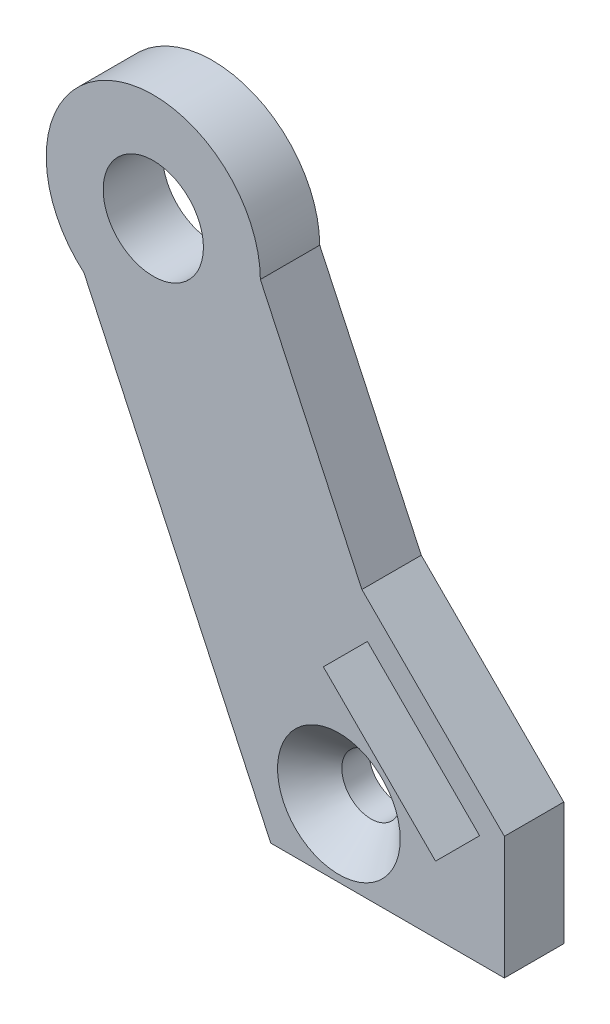
ISO-10303-21;
HEADER;
FILE_DESCRIPTION(('STEP AP214'),'2;1');
FILE_NAME('part.step','',(''),(''),'','','');
FILE_SCHEMA(('AUTOMOTIVE_DESIGN { 1 0 10303 214 1 1 1 1 }'));
ENDSEC;
DATA;
#1=APPLICATION_CONTEXT('core data for automotive mechanical design processes');
#2=APPLICATION_PROTOCOL_DEFINITION('international standard','automotive_design',2000,#1);
#3=PRODUCT_CONTEXT('',#1,'mechanical');
#4=PRODUCT('Part','Part','',(#3));
#5=PRODUCT_RELATED_PRODUCT_CATEGORY('part','',(#4));
#6=PRODUCT_DEFINITION_FORMATION('','',#4);
#7=PRODUCT_DEFINITION_CONTEXT('part definition',#1,'design');
#8=PRODUCT_DEFINITION('design','',#6,#7);
#9=PRODUCT_DEFINITION_SHAPE('','',#8);
#10=(LENGTH_UNIT() NAMED_UNIT(*) SI_UNIT(.MILLI.,.METRE.));
#11=(NAMED_UNIT(*) PLANE_ANGLE_UNIT() SI_UNIT($,.RADIAN.));
#12=(NAMED_UNIT(*) SI_UNIT($,.STERADIAN.) SOLID_ANGLE_UNIT());
#13=UNCERTAINTY_MEASURE_WITH_UNIT(LENGTH_MEASURE(1.E-05),#10,'distance_accuracy_value','');
#14=(GEOMETRIC_REPRESENTATION_CONTEXT(3) GLOBAL_UNCERTAINTY_ASSIGNED_CONTEXT((#13)) GLOBAL_UNIT_ASSIGNED_CONTEXT((#10,
#11,#12)) REPRESENTATION_CONTEXT('',''));
#15=CARTESIAN_POINT('',(0.,0.,0.));
#16=DIRECTION('',(0.,0.,1.));
#17=DIRECTION('',(1.,0.,0.));
#18=AXIS2_PLACEMENT_3D('',#15,#16,#17);
#19=CARTESIAN_POINT('',(3.5,3.5,3.05));
#20=DIRECTION('',(0.,0.,-1.));
#21=DIRECTION('',(-1.,0.,0.));
#22=AXIS2_PLACEMENT_3D('',#19,#20,#21);
#23=CYLINDRICAL_SURFACE('',#22,1.5);
#24=CARTESIAN_POINT('',(3.5,3.5,0.));
#25=DIRECTION('',(0.,0.,1.));
#26=DIRECTION('',(1.,0.,0.));
#27=AXIS2_PLACEMENT_3D('',#24,#25,#26);
#28=CIRCLE('',#27,1.5);
#29=CARTESIAN_POINT('',(5.,3.5,0.));
#30=VERTEX_POINT('',#29);
#31=EDGE_CURVE('E161',#30,#30,#28,.T.);
#32=ORIENTED_EDGE('',*,*,#31,.F.);
#33=EDGE_LOOP('',(#32));
#34=FACE_BOUND('',#33,.T.);
#35=CARTESIAN_POINT('',(3.5,3.5,1.4));
#36=DIRECTION('',(0.,0.,1.));
#37=DIRECTION('',(1.,0.,0.));
#38=AXIS2_PLACEMENT_3D('',#35,#36,#37);
#39=CIRCLE('',#38,1.5);
#40=CARTESIAN_POINT('',(5.,3.5,1.4));
#41=VERTEX_POINT('',#40);
#42=EDGE_CURVE('E11',#41,#41,#39,.T.);
#43=ORIENTED_EDGE('',*,*,#42,.T.);
#44=EDGE_LOOP('',(#43));
#45=FACE_BOUND('',#44,.T.);
#46=ADVANCED_FACE('F45',(#34,#45),#23,.F.);
#47=CARTESIAN_POINT('',(8.20970869120796,8.20970869120796,3.05));
#48=DIRECTION('',(0.707106781186548,0.707106781186547,0.));
#49=DIRECTION('',(-0.707106781186547,0.707106781186548,0.));
#50=AXIS2_PLACEMENT_3D('',#47,#48,#49);
#51=PLANE('',#50);
#52=DIRECTION('',(0.707106781186547,-0.707106781186548,0.));
#53=VECTOR('',#52,1.);
#54=CARTESIAN_POINT('',(8.20970869120796,8.20970869120796,0.));
#55=LINE('',#54,#53);
#56=CARTESIAN_POINT('',(4.96428752719385,11.4551298552221,0.));
#57=VERTEX_POINT('',#56);
#58=CARTESIAN_POINT('',(10.7272077938642,5.6922095885517,0.));
#59=VERTEX_POINT('',#58);
#60=EDGE_CURVE('E194',#57,#59,#55,.T.);
#61=ORIENTED_EDGE('',*,*,#60,.T.);
#62=DIRECTION('',(0.,0.,-1.));
#63=VECTOR('',#62,1.);
#64=CARTESIAN_POINT('',(10.7272077938642,5.6922095885517,3.05));
#65=LINE('',#64,#63);
#66=CARTESIAN_POINT('',(10.7272077938642,5.6922095885517,3.05));
#67=VERTEX_POINT('',#66);
#68=EDGE_CURVE('E55',#67,#59,#65,.T.);
#69=ORIENTED_EDGE('',*,*,#68,.F.);
#70=DIRECTION('',(0.707106781186547,-0.707106781186548,0.));
#71=VECTOR('',#70,1.);
#72=CARTESIAN_POINT('',(8.20970869120796,8.20970869120796,3.05));
#73=LINE('',#72,#71);
#74=CARTESIAN_POINT('',(4.96428752719385,11.4551298552221,3.05));
#75=VERTEX_POINT('',#74);
#76=EDGE_CURVE('E149',#75,#67,#73,.T.);
#77=ORIENTED_EDGE('',*,*,#76,.F.);
#78=DIRECTION('',(0.,0.,-1.));
#79=VECTOR('',#78,1.);
#80=CARTESIAN_POINT('',(4.96428752719385,11.4551298552221,3.05));
#81=LINE('',#80,#79);
#82=EDGE_CURVE('E205',#75,#57,#81,.T.);
#83=ORIENTED_EDGE('',*,*,#82,.T.);
#84=EDGE_LOOP('',(#61,#69,#77,#83));
#85=FACE_BOUND('',#84,.T.);
#86=ADVANCED_FACE('F266',(#85),#51,.F.);
#87=CARTESIAN_POINT('',(2.51749910265625,-2.51749910265625,3.05));
#88=DIRECTION('',(-0.707106781186548,0.707106781186548,0.));
#89=DIRECTION('',(-0.707106781186548,-0.707106781186548,0.));
#90=AXIS2_PLACEMENT_3D('',#87,#88,#89);
#91=PLANE('',#90);
#92=DIRECTION('',(0.707106781186548,0.707106781186548,0.));
#93=VECTOR('',#92,1.);
#94=CARTESIAN_POINT('',(2.51749910265625,-2.51749910265625,0.));
#95=LINE('',#94,#93);
#96=CARTESIAN_POINT('',(8.46446609406726,3.42946788875475,0.));
#97=VERTEX_POINT('',#96);
#98=EDGE_CURVE('E139',#97,#59,#95,.T.);
#99=ORIENTED_EDGE('',*,*,#98,.F.);
#100=DIRECTION('',(0.,0.,-1.));
#101=VECTOR('',#100,1.);
#102=CARTESIAN_POINT('',(8.46446609406726,3.42946788875475,3.05));
#103=LINE('',#102,#101);
#104=CARTESIAN_POINT('',(8.46446609406726,3.42946788875475,3.05));
#105=VERTEX_POINT('',#104);
#106=EDGE_CURVE('E133',#105,#97,#103,.T.);
#107=ORIENTED_EDGE('',*,*,#106,.F.);
#108=DIRECTION('',(0.707106781186548,0.707106781186548,0.));
#109=VECTOR('',#108,1.);
#110=CARTESIAN_POINT('',(2.51749910265625,-2.51749910265625,3.05));
#111=LINE('',#110,#109);
#112=EDGE_CURVE('E137',#105,#67,#111,.T.);
#113=ORIENTED_EDGE('',*,*,#112,.T.);
#114=ORIENTED_EDGE('',*,*,#68,.T.);
#115=EDGE_LOOP('',(#99,#107,#113,#114));
#116=FACE_BOUND('',#115,.T.);
#117=ADVANCED_FACE('F135',(#116),#91,.T.);
#118=CARTESIAN_POINT('',(5.94696699141101,5.94696699141101,3.05));
#119=DIRECTION('',(-0.707106781186547,-0.707106781186548,0.));
#120=DIRECTION('',(0.707106781186548,-0.707106781186547,0.));
#121=AXIS2_PLACEMENT_3D('',#118,#119,#120);
#122=PLANE('',#121);
#123=DIRECTION('',(-0.707106781186548,0.707106781186547,0.));
#124=VECTOR('',#123,1.);
#125=CARTESIAN_POINT('',(5.94696699141101,5.94696699141101,0.));
#126=LINE('',#125,#124);
#127=CARTESIAN_POINT('',(2.7015458273969,9.19238815542512,0.));
#128=VERTEX_POINT('',#127);
#129=EDGE_CURVE('E98',#97,#128,#126,.T.);
#130=ORIENTED_EDGE('',*,*,#129,.T.);
#131=DIRECTION('',(0.,0.,-1.));
#132=VECTOR('',#131,1.);
#133=CARTESIAN_POINT('',(2.7015458273969,9.19238815542512,3.05));
#134=LINE('',#133,#132);
#135=CARTESIAN_POINT('',(2.7015458273969,9.19238815542512,3.05));
#136=VERTEX_POINT('',#135);
#137=EDGE_CURVE('E141',#136,#128,#134,.T.);
#138=ORIENTED_EDGE('',*,*,#137,.F.);
#139=DIRECTION('',(-0.707106781186548,0.707106781186547,0.));
#140=VECTOR('',#139,1.);
#141=CARTESIAN_POINT('',(5.94696699141101,5.94696699141101,3.05));
#142=LINE('',#141,#140);
#143=EDGE_CURVE('E143',#105,#136,#142,.T.);
#144=ORIENTED_EDGE('',*,*,#143,.F.);
#145=ORIENTED_EDGE('',*,*,#106,.T.);
#146=EDGE_LOOP('',(#130,#138,#144,#145));
#147=FACE_BOUND('',#146,.T.);
#148=ADVANCED_FACE('F144',(#147),#122,.F.);
#149=CARTESIAN_POINT('',(0.,0.,3.05));
#150=DIRECTION('',(-0.906307787036648,-0.422618261740703,0.));
#151=DIRECTION('',(0.422618261740703,-0.906307787036648,0.));
#152=AXIS2_PLACEMENT_3D('',#149,#150,#151);
#153=PLANE('',#152);
#154=DIRECTION('',(-0.422618261740703,0.906307787036648,0.));
#155=VECTOR('',#154,1.);
#156=CARTESIAN_POINT('',(0.,0.,0.));
#157=LINE('',#156,#155);
#158=CARTESIAN_POINT('',(0.,0.,0.));
#159=VERTEX_POINT('',#158);
#160=CARTESIAN_POINT('',(-9.59711645626916,20.5810826574052,0.));
#161=VERTEX_POINT('',#160);
#162=EDGE_CURVE('E165',#159,#161,#157,.T.);
#163=ORIENTED_EDGE('',*,*,#162,.F.);
#164=DIRECTION('',(0.,0.,-1.));
#165=VECTOR('',#164,1.);
#166=CARTESIAN_POINT('',(0.,0.,3.05));
#167=LINE('',#166,#165);
#168=CARTESIAN_POINT('',(0.,0.,3.05));
#169=VERTEX_POINT('',#168);
#170=EDGE_CURVE('E48',#169,#159,#167,.T.);
#171=ORIENTED_EDGE('',*,*,#170,.F.);
#172=DIRECTION('',(-0.422618261740703,0.906307787036648,0.));
#173=VECTOR('',#172,1.);
#174=CARTESIAN_POINT('',(0.,0.,3.05));
#175=LINE('',#174,#173);
#176=CARTESIAN_POINT('',(-9.59711645626916,20.5810826574052,3.05));
#177=VERTEX_POINT('',#176);
#178=EDGE_CURVE('E204',#169,#177,#175,.T.);
#179=ORIENTED_EDGE('',*,*,#178,.T.);
#180=DIRECTION('',(0.,0.,-1.));
#181=VECTOR('',#180,1.);
#182=CARTESIAN_POINT('',(-9.59711645626916,20.5810826574052,3.05));
#183=LINE('',#182,#181);
#184=EDGE_CURVE('E160',#177,#161,#183,.T.);
#185=ORIENTED_EDGE('',*,*,#184,.T.);
#186=EDGE_LOOP('',(#163,#171,#179,#185));
#187=FACE_BOUND('',#186,.T.);
#188=ADVANCED_FACE('F238',(#187),#153,.T.);
#189=CARTESIAN_POINT('',(0.,0.,3.05));
#190=DIRECTION('',(0.,1.,0.));
#191=DIRECTION('',(0.,0.,1.));
#192=AXIS2_PLACEMENT_3D('',#189,#190,#191);
#193=PLANE('',#192);
#194=DIRECTION('',(1.,0.,0.));
#195=VECTOR('',#194,1.);
#196=CARTESIAN_POINT('',(0.,0.,0.));
#197=LINE('',#196,#195);
#198=CARTESIAN_POINT('',(12.,0.,0.));
#199=VERTEX_POINT('',#198);
#200=EDGE_CURVE('E170',#159,#199,#197,.T.);
#201=ORIENTED_EDGE('',*,*,#200,.T.);
#202=DIRECTION('',(0.,0.,-1.));
#203=VECTOR('',#202,1.);
#204=CARTESIAN_POINT('',(12.,0.,3.05));
#205=LINE('',#204,#203);
#206=CARTESIAN_POINT('',(12.,0.,3.05));
#207=VERTEX_POINT('',#206);
#208=EDGE_CURVE('E222',#207,#199,#205,.T.);
#209=ORIENTED_EDGE('',*,*,#208,.F.);
#210=DIRECTION('',(1.,0.,0.));
#211=VECTOR('',#210,1.);
#212=CARTESIAN_POINT('',(0.,0.,3.05));
#213=LINE('',#212,#211);
#214=EDGE_CURVE('E232',#169,#207,#213,.T.);
#215=ORIENTED_EDGE('',*,*,#214,.F.);
#216=ORIENTED_EDGE('',*,*,#170,.T.);
#217=EDGE_LOOP('',(#201,#209,#215,#216));
#218=FACE_BOUND('',#217,.T.);
#219=ADVANCED_FACE('F230',(#218),#193,.F.);
#220=CARTESIAN_POINT('',(12.,0.,3.05));
#221=DIRECTION('',(-1.,0.,0.));
#222=DIRECTION('',(0.,0.,1.));
#223=AXIS2_PLACEMENT_3D('',#220,#221,#222);
#224=PLANE('',#223);
#225=DIRECTION('',(0.,1.,0.));
#226=VECTOR('',#225,1.);
#227=CARTESIAN_POINT('',(12.,0.,0.));
#228=LINE('',#227,#226);
#229=CARTESIAN_POINT('',(12.,6.3039086153561,0.));
#230=VERTEX_POINT('',#229);
#231=EDGE_CURVE('E174',#199,#230,#228,.T.);
#232=ORIENTED_EDGE('',*,*,#231,.T.);
#233=DIRECTION('',(0.,0.,-1.));
#234=VECTOR('',#233,1.);
#235=CARTESIAN_POINT('',(12.,6.3039086153561,3.05));
#236=LINE('',#235,#234);
#237=CARTESIAN_POINT('',(12.,6.3039086153561,3.05));
#238=VERTEX_POINT('',#237);
#239=EDGE_CURVE('E220',#238,#230,#236,.T.);
#240=ORIENTED_EDGE('',*,*,#239,.F.);
#241=DIRECTION('',(0.,1.,0.));
#242=VECTOR('',#241,1.);
#243=CARTESIAN_POINT('',(12.,0.,3.05));
#244=LINE('',#243,#242);
#245=EDGE_CURVE('E291',#207,#238,#244,.T.);
#246=ORIENTED_EDGE('',*,*,#245,.F.);
#247=ORIENTED_EDGE('',*,*,#208,.T.);
#248=EDGE_LOOP('',(#232,#240,#246,#247));
#249=FACE_BOUND('',#248,.T.);
#250=ADVANCED_FACE('F256',(#249),#224,.F.);
#251=CARTESIAN_POINT('',(9.15195430767813,9.15195430767801,3.05));
#252=DIRECTION('',(0.707106781186552,0.707106781186543,0.));
#253=DIRECTION('',(-0.707106781186543,0.707106781186552,0.));
#254=AXIS2_PLACEMENT_3D('',#251,#252,#253);
#255=PLANE('',#254);
#256=DIRECTION('',(0.707106781186543,-0.707106781186552,0.));
#257=VECTOR('',#256,1.);
#258=CARTESIAN_POINT('',(9.15195430767813,9.15195430767801,0.));
#259=LINE('',#258,#257);
#260=CARTESIAN_POINT('',(4.68158568563559,13.6223229297206,0.));
#261=VERTEX_POINT('',#260);
#262=EDGE_CURVE('E178',#261,#230,#259,.T.);
#263=ORIENTED_EDGE('',*,*,#262,.F.);
#264=DIRECTION('',(0.,0.,-1.));
#265=VECTOR('',#264,1.);
#266=CARTESIAN_POINT('',(4.68158568563559,13.6223229297206,3.05));
#267=LINE('',#266,#265);
#268=CARTESIAN_POINT('',(4.68158568563559,13.6223229297206,3.05));
#269=VERTEX_POINT('',#268);
#270=EDGE_CURVE('E217',#269,#261,#267,.T.);
#271=ORIENTED_EDGE('',*,*,#270,.F.);
#272=DIRECTION('',(0.707106781186543,-0.707106781186552,0.));
#273=VECTOR('',#272,1.);
#274=CARTESIAN_POINT('',(9.15195430767813,9.15195430767801,3.05));
#275=LINE('',#274,#273);
#276=EDGE_CURVE('E255',#269,#238,#275,.T.);
#277=ORIENTED_EDGE('',*,*,#276,.T.);
#278=ORIENTED_EDGE('',*,*,#239,.T.);
#279=EDGE_LOOP('',(#263,#271,#277,#278));
#280=FACE_BOUND('',#279,.T.);
#281=ADVANCED_FACE('F253',(#280),#255,.T.);
#282=CARTESIAN_POINT('',(9.0630778703663,4.22618261740677,3.05));
#283=DIRECTION('',(0.906307787036655,0.422618261740689,0.));
#284=DIRECTION('',(-0.422618261740689,0.906307787036655,0.));
#285=AXIS2_PLACEMENT_3D('',#282,#283,#284);
#286=PLANE('',#285);
#287=DIRECTION('',(0.422618261740689,-0.906307787036655,0.));
#288=VECTOR('',#287,1.);
#289=CARTESIAN_POINT('',(9.0630778703663,4.22618261740677,0.));
#290=LINE('',#289,#288);
#291=CARTESIAN_POINT('',(-0.534038585902411,24.8072652748118,0.));
#292=VERTEX_POINT('',#291);
#293=EDGE_CURVE('E182',#292,#261,#290,.T.);
#294=ORIENTED_EDGE('',*,*,#293,.F.);
#295=DIRECTION('',(0.,0.,-1.));
#296=VECTOR('',#295,1.);
#297=CARTESIAN_POINT('',(-0.534038585902411,24.8072652748118,3.05));
#298=LINE('',#297,#296);
#299=CARTESIAN_POINT('',(-0.534038585902411,24.8072652748118,3.05));
#300=VERTEX_POINT('',#299);
#301=EDGE_CURVE('E214',#300,#292,#298,.T.);
#302=ORIENTED_EDGE('',*,*,#301,.F.);
#303=DIRECTION('',(0.422618261740689,-0.906307787036655,0.));
#304=VECTOR('',#303,1.);
#305=CARTESIAN_POINT('',(9.0630778703663,4.22618261740677,3.05));
#306=LINE('',#305,#304);
#307=EDGE_CURVE('E249',#300,#269,#306,.T.);
#308=ORIENTED_EDGE('',*,*,#307,.T.);
#309=ORIENTED_EDGE('',*,*,#270,.T.);
#310=EDGE_LOOP('',(#294,#302,#308,#309));
#311=FACE_BOUND('',#310,.T.);
#312=ADVANCED_FACE('F245',(#311),#286,.T.);
#313=CARTESIAN_POINT('',(-6.03391760833418,24.7707859846198,3.05));
#314=DIRECTION('',(0.,0.,-1.));
#315=DIRECTION('',(-1.,0.,0.));
#316=AXIS2_PLACEMENT_3D('',#313,#314,#315);
#317=CYLINDRICAL_SURFACE('',#316,2.57499999999981);
#318=CARTESIAN_POINT('',(-6.03391760833418,24.7707859846198,3.05));
#319=DIRECTION('',(0.,0.,1.));
#320=DIRECTION('',(1.,0.,0.));
#321=AXIS2_PLACEMENT_3D('',#318,#319,#320);
#322=CIRCLE('',#321,2.57499999999981);
#323=CARTESIAN_POINT('',(-3.45891760833437,24.7707859846198,3.05));
#324=VERTEX_POINT('',#323);
#325=EDGE_CURVE('E154',#324,#324,#322,.T.);
#326=ORIENTED_EDGE('',*,*,#325,.T.);
#327=EDGE_LOOP('',(#326));
#328=FACE_BOUND('',#327,.T.);
#329=CARTESIAN_POINT('',(-6.03391760833418,24.7707859846198,0.));
#330=DIRECTION('',(0.,0.,1.));
#331=DIRECTION('',(1.,0.,0.));
#332=AXIS2_PLACEMENT_3D('',#329,#330,#331);
#333=CIRCLE('',#332,2.57499999999981);
#334=CARTESIAN_POINT('',(-3.45891760833437,24.7707859846198,0.));
#335=VERTEX_POINT('',#334);
#336=EDGE_CURVE('E190',#335,#335,#333,.T.);
#337=ORIENTED_EDGE('',*,*,#336,.F.);
#338=EDGE_LOOP('',(#337));
#339=FACE_BOUND('',#338,.T.);
#340=ADVANCED_FACE('F304',(#328,#339),#317,.F.);
#341=CARTESIAN_POINT('',(-6.03391760833418,24.7707859846198,3.05));
#342=DIRECTION('',(0.,0.,-1.));
#343=DIRECTION('',(-1.,0.,0.));
#344=AXIS2_PLACEMENT_3D('',#341,#342,#343);
#345=CYLINDRICAL_SURFACE('',#344,5.49999999999981);
#346=CARTESIAN_POINT('',(-6.03391760833418,24.7707859846198,0.));
#347=DIRECTION('',(0.,0.,1.));
#348=DIRECTION('',(1.,0.,0.));
#349=AXIS2_PLACEMENT_3D('',#346,#347,#348);
#350=CIRCLE('',#349,5.49999999999981);
#351=EDGE_CURVE('E186',#292,#161,#350,.T.);
#352=ORIENTED_EDGE('',*,*,#351,.T.);
#353=ORIENTED_EDGE('',*,*,#184,.F.);
#354=CARTESIAN_POINT('',(-6.03391760833418,24.7707859846198,3.05));
#355=DIRECTION('',(0.,0.,1.));
#356=DIRECTION('',(1.,0.,0.));
#357=AXIS2_PLACEMENT_3D('',#354,#355,#356);
#358=CIRCLE('',#357,5.49999999999981);
#359=EDGE_CURVE('E298',#300,#177,#358,.T.);
#360=ORIENTED_EDGE('',*,*,#359,.F.);
#361=ORIENTED_EDGE('',*,*,#301,.T.);
#362=EDGE_LOOP('',(#352,#353,#360,#361));
#363=FACE_BOUND('',#362,.T.);
#364=ADVANCED_FACE('F242',(#363),#345,.T.);
#365=CARTESIAN_POINT('',(-3.24542116401411,3.24542116401411,3.05));
#366=DIRECTION('',(-0.707106781186548,0.707106781186547,0.));
#367=DIRECTION('',(-0.707106781186547,-0.707106781186548,0.));
#368=AXIS2_PLACEMENT_3D('',#365,#366,#367);
#369=PLANE('',#368);
#370=DIRECTION('',(0.707106781186547,0.707106781186548,0.));
#371=VECTOR('',#370,1.);
#372=CARTESIAN_POINT('',(-3.24542116401411,3.24542116401411,0.));
#373=LINE('',#372,#371);
#374=EDGE_CURVE('E104',#128,#57,#373,.T.);
#375=ORIENTED_EDGE('',*,*,#374,.T.);
#376=ORIENTED_EDGE('',*,*,#82,.F.);
#377=DIRECTION('',(0.707106781186547,0.707106781186548,0.));
#378=VECTOR('',#377,1.);
#379=CARTESIAN_POINT('',(-3.24542116401411,3.24542116401411,3.05));
#380=LINE('',#379,#378);
#381=EDGE_CURVE('E64',#136,#75,#380,.T.);
#382=ORIENTED_EDGE('',*,*,#381,.F.);
#383=ORIENTED_EDGE('',*,*,#137,.T.);
#384=EDGE_LOOP('',(#375,#376,#382,#383));
#385=FACE_BOUND('',#384,.T.);
#386=ADVANCED_FACE('F308',(#385),#369,.F.);
#387=CARTESIAN_POINT('',(0.,0.,3.05));
#388=DIRECTION('',(0.,0.,1.));
#389=DIRECTION('',(1.,0.,0.));
#390=AXIS2_PLACEMENT_3D('',#387,#388,#389);
#391=PLANE('',#390);
#392=CARTESIAN_POINT('',(3.5,3.5,3.05));
#393=DIRECTION('',(0.,0.,1.));
#394=DIRECTION('',(1.,0.,0.));
#395=AXIS2_PLACEMENT_3D('',#392,#393,#394);
#396=CIRCLE('',#395,3.15);
#397=CARTESIAN_POINT('',(6.65,3.5,3.05));
#398=VERTEX_POINT('',#397);
#399=EDGE_CURVE('E166',#398,#398,#396,.T.);
#400=ORIENTED_EDGE('',*,*,#399,.F.);
#401=EDGE_LOOP('',(#400));
#402=FACE_BOUND('',#401,.T.);
#403=ORIENTED_EDGE('',*,*,#178,.F.);
#404=ORIENTED_EDGE('',*,*,#214,.T.);
#405=ORIENTED_EDGE('',*,*,#245,.T.);
#406=ORIENTED_EDGE('',*,*,#276,.F.);
#407=ORIENTED_EDGE('',*,*,#307,.F.);
#408=ORIENTED_EDGE('',*,*,#359,.T.);
#409=EDGE_LOOP('',(#403,#404,#405,#406,#407,#408));
#410=FACE_BOUND('',#409,.T.);
#411=ORIENTED_EDGE('',*,*,#325,.F.);
#412=EDGE_LOOP('',(#411));
#413=FACE_BOUND('',#412,.T.);
#414=ORIENTED_EDGE('',*,*,#76,.T.);
#415=ORIENTED_EDGE('',*,*,#112,.F.);
#416=ORIENTED_EDGE('',*,*,#143,.T.);
#417=ORIENTED_EDGE('',*,*,#381,.T.);
#418=EDGE_LOOP('',(#414,#415,#416,#417));
#419=FACE_BOUND('',#418,.T.);
#420=ADVANCED_FACE('F147',(#402,#410,#413,#419),#391,.T.);
#421=CARTESIAN_POINT('',(0.,0.,0.));
#422=DIRECTION('',(0.,0.,1.));
#423=DIRECTION('',(1.,0.,0.));
#424=AXIS2_PLACEMENT_3D('',#421,#422,#423);
#425=PLANE('',#424);
#426=ORIENTED_EDGE('',*,*,#31,.T.);
#427=EDGE_LOOP('',(#426));
#428=FACE_BOUND('',#427,.T.);
#429=ORIENTED_EDGE('',*,*,#162,.T.);
#430=ORIENTED_EDGE('',*,*,#351,.F.);
#431=ORIENTED_EDGE('',*,*,#293,.T.);
#432=ORIENTED_EDGE('',*,*,#262,.T.);
#433=ORIENTED_EDGE('',*,*,#231,.F.);
#434=ORIENTED_EDGE('',*,*,#200,.F.);
#435=EDGE_LOOP('',(#429,#430,#431,#432,#433,#434));
#436=FACE_BOUND('',#435,.T.);
#437=ORIENTED_EDGE('',*,*,#336,.T.);
#438=EDGE_LOOP('',(#437));
#439=FACE_BOUND('',#438,.T.);
#440=ORIENTED_EDGE('',*,*,#60,.F.);
#441=ORIENTED_EDGE('',*,*,#374,.F.);
#442=ORIENTED_EDGE('',*,*,#129,.F.);
#443=ORIENTED_EDGE('',*,*,#98,.T.);
#444=EDGE_LOOP('',(#440,#441,#442,#443));
#445=FACE_BOUND('',#444,.T.);
#446=ADVANCED_FACE('F235',(#428,#436,#439,#445),#425,.F.);
#447=CARTESIAN_POINT('',(3.5,3.5,3.05));
#448=DIRECTION('',(0.,0.,1.));
#449=DIRECTION('',(1.,0.,0.));
#450=AXIS2_PLACEMENT_3D('',#447,#448,#449);
#451=CONICAL_SURFACE('',#450,3.15,0.785398163397449);
#452=ORIENTED_EDGE('',*,*,#42,.F.);
#453=EDGE_LOOP('',(#452));
#454=FACE_BOUND('',#453,.T.);
#455=ORIENTED_EDGE('',*,*,#399,.T.);
#456=EDGE_LOOP('',(#455));
#457=FACE_BOUND('',#456,.T.);
#458=ADVANCED_FACE('F277',(#454,#457),#451,.F.);
#459=CLOSED_SHELL('',(#46,#86,#117,#148,#188,#219,#250,#281,#312,#340,#364,#386,#420,#446,#458));
#460=MANIFOLD_SOLID_BREP('B2',#459);
#461=ADVANCED_BREP_SHAPE_REPRESENTATION('',(#18,#460),#14);
#462=SHAPE_DEFINITION_REPRESENTATION(#9,#461);
ENDSEC;
END-ISO-10303-21;
